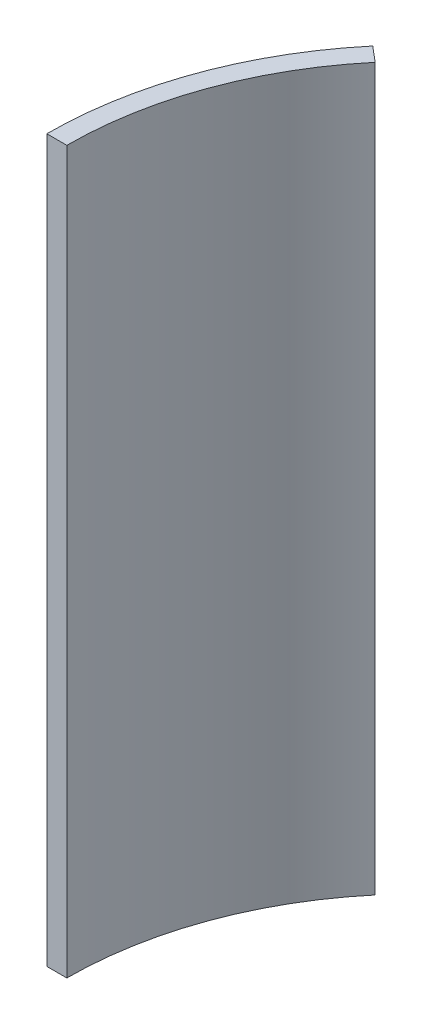
ISO-10303-21;
HEADER;
FILE_DESCRIPTION(('STEP AP214'),'2;1');
FILE_NAME('part.step','',(''),(''),'','','');
FILE_SCHEMA(('AUTOMOTIVE_DESIGN { 1 0 10303 214 1 1 1 1 }'));
ENDSEC;
DATA;
#1=APPLICATION_CONTEXT('core data for automotive mechanical design processes');
#2=APPLICATION_PROTOCOL_DEFINITION('international standard','automotive_design',2000,#1);
#3=PRODUCT_CONTEXT('',#1,'mechanical');
#4=PRODUCT('Part','Part','',(#3));
#5=PRODUCT_RELATED_PRODUCT_CATEGORY('part','',(#4));
#6=PRODUCT_DEFINITION_FORMATION('','',#4);
#7=PRODUCT_DEFINITION_CONTEXT('part definition',#1,'design');
#8=PRODUCT_DEFINITION('design','',#6,#7);
#9=PRODUCT_DEFINITION_SHAPE('','',#8);
#10=(LENGTH_UNIT() NAMED_UNIT(*) SI_UNIT(.MILLI.,.METRE.));
#11=(NAMED_UNIT(*) PLANE_ANGLE_UNIT() SI_UNIT($,.RADIAN.));
#12=(NAMED_UNIT(*) SI_UNIT($,.STERADIAN.) SOLID_ANGLE_UNIT());
#13=UNCERTAINTY_MEASURE_WITH_UNIT(LENGTH_MEASURE(1.E-05),#10,'distance_accuracy_value','');
#14=(GEOMETRIC_REPRESENTATION_CONTEXT(3) GLOBAL_UNCERTAINTY_ASSIGNED_CONTEXT((#13)) GLOBAL_UNIT_ASSIGNED_CONTEXT((#10,
#11,#12)) REPRESENTATION_CONTEXT('',''));
#15=CARTESIAN_POINT('',(0.,0.,0.));
#16=DIRECTION('',(0.,0.,1.));
#17=DIRECTION('',(1.,0.,0.));
#18=AXIS2_PLACEMENT_3D('',#15,#16,#17);
#19=CARTESIAN_POINT('',(77.7861913430201,200.,0.));
#20=DIRECTION('',(0.,-1.,0.));
#21=DIRECTION('',(0.,0.,-1.));
#22=AXIS2_PLACEMENT_3D('',#19,#20,#21);
#23=CYLINDRICAL_SURFACE('',#22,87.7861913430201);
#24=CARTESIAN_POINT('',(77.7861913430201,20.,0.));
#25=DIRECTION('',(0.,-1.,0.));
#26=DIRECTION('',(0.,0.,1.));
#27=AXIS2_PLACEMENT_3D('',#24,#25,#26);
#28=CIRCLE('',#27,87.7861913430201);
#29=CARTESIAN_POINT('',(-9.99999999999999,20.,0.));
#30=VERTEX_POINT('',#29);
#31=CARTESIAN_POINT('',(10.5380672821205,20.,-56.4278760968654));
#32=VERTEX_POINT('',#31);
#33=EDGE_CURVE('E96',#30,#32,#28,.T.);
#34=ORIENTED_EDGE('',*,*,#33,.T.);
#35=DIRECTION('',(0.,-1.,0.));
#36=VECTOR('',#35,1.);
#37=CARTESIAN_POINT('',(10.5380672821205,200.,-56.4278760968654));
#38=LINE('',#37,#36);
#39=CARTESIAN_POINT('',(10.5380672821205,200.,-56.4278760968654));
#40=VERTEX_POINT('',#39);
#41=EDGE_CURVE('E11',#40,#32,#38,.T.);
#42=ORIENTED_EDGE('',*,*,#41,.F.);
#43=CARTESIAN_POINT('',(77.7861913430201,200.,0.));
#44=DIRECTION('',(0.,-1.,0.));
#45=DIRECTION('',(0.,0.,1.));
#46=AXIS2_PLACEMENT_3D('',#43,#44,#45);
#47=CIRCLE('',#46,87.7861913430201);
#48=CARTESIAN_POINT('',(-9.99999999999999,200.,0.));
#49=VERTEX_POINT('',#48);
#50=EDGE_CURVE('E84',#49,#40,#47,.T.);
#51=ORIENTED_EDGE('',*,*,#50,.F.);
#52=DIRECTION('',(0.,-1.,0.));
#53=VECTOR('',#52,1.);
#54=CARTESIAN_POINT('',(-9.99999999999999,200.,0.));
#55=LINE('',#54,#53);
#56=EDGE_CURVE('E92',#49,#30,#55,.T.);
#57=ORIENTED_EDGE('',*,*,#56,.T.);
#58=EDGE_LOOP('',(#34,#42,#51,#57));
#59=FACE_BOUND('',#58,.T.);
#60=ADVANCED_FACE('F33',(#59),#23,.F.);
#61=CARTESIAN_POINT('',(6.70784506652562,200.,-59.6418141452981));
#62=DIRECTION('',(-0.64278760968654,0.,0.766044443118977));
#63=DIRECTION('',(0.766044443118978,0.,0.64278760968654));
#64=AXIS2_PLACEMENT_3D('',#61,#62,#63);
#65=PLANE('',#64);
#66=DIRECTION('',(-0.766044443118977,0.,-0.64278760968654));
#67=VECTOR('',#66,1.);
#68=CARTESIAN_POINT('',(6.70784506652562,20.,-59.6418141452981));
#69=LINE('',#68,#67);
#70=CARTESIAN_POINT('',(6.70784506652562,20.,-59.6418141452981));
#71=VERTEX_POINT('',#70);
#72=EDGE_CURVE('E88',#32,#71,#69,.T.);
#73=ORIENTED_EDGE('',*,*,#72,.T.);
#74=DIRECTION('',(0.,-1.,0.));
#75=VECTOR('',#74,1.);
#76=CARTESIAN_POINT('',(6.70784506652562,200.,-59.6418141452981));
#77=LINE('',#76,#75);
#78=CARTESIAN_POINT('',(6.70784506652562,200.,-59.6418141452981));
#79=VERTEX_POINT('',#78);
#80=EDGE_CURVE('E41',#79,#71,#77,.T.);
#81=ORIENTED_EDGE('',*,*,#80,.F.);
#82=DIRECTION('',(-0.766044443118977,0.,-0.64278760968654));
#83=VECTOR('',#82,1.);
#84=CARTESIAN_POINT('',(6.70784506652562,200.,-59.6418141452981));
#85=LINE('',#84,#83);
#86=EDGE_CURVE('E79',#40,#79,#85,.T.);
#87=ORIENTED_EDGE('',*,*,#86,.F.);
#88=ORIENTED_EDGE('',*,*,#41,.T.);
#89=EDGE_LOOP('',(#73,#81,#87,#88));
#90=FACE_BOUND('',#89,.T.);
#91=ADVANCED_FACE('F87',(#90),#65,.F.);
#92=CARTESIAN_POINT('',(77.7861913430201,200.,0.));
#93=DIRECTION('',(0.,-1.,0.));
#94=DIRECTION('',(0.,0.,-1.));
#95=AXIS2_PLACEMENT_3D('',#92,#93,#94);
#96=CYLINDRICAL_SURFACE('',#95,92.7861913430201);
#97=CARTESIAN_POINT('',(77.7861913430201,20.,0.));
#98=DIRECTION('',(0.,1.,0.));
#99=DIRECTION('',(0.,0.,1.));
#100=AXIS2_PLACEMENT_3D('',#97,#98,#99);
#101=CIRCLE('',#100,92.7861913430201);
#102=CARTESIAN_POINT('',(-15.,20.,0.));
#103=VERTEX_POINT('',#102);
#104=EDGE_CURVE('E66',#71,#103,#101,.T.);
#105=ORIENTED_EDGE('',*,*,#104,.T.);
#106=DIRECTION('',(0.,-1.,0.));
#107=VECTOR('',#106,1.);
#108=CARTESIAN_POINT('',(-15.,200.,0.));
#109=LINE('',#108,#107);
#110=CARTESIAN_POINT('',(-15.,200.,0.));
#111=VERTEX_POINT('',#110);
#112=EDGE_CURVE('E89',#111,#103,#109,.T.);
#113=ORIENTED_EDGE('',*,*,#112,.F.);
#114=CARTESIAN_POINT('',(77.7861913430201,200.,0.));
#115=DIRECTION('',(0.,1.,0.));
#116=DIRECTION('',(0.,0.,1.));
#117=AXIS2_PLACEMENT_3D('',#114,#115,#116);
#118=CIRCLE('',#117,92.7861913430201);
#119=EDGE_CURVE('E82',#79,#111,#118,.T.);
#120=ORIENTED_EDGE('',*,*,#119,.F.);
#121=ORIENTED_EDGE('',*,*,#80,.T.);
#122=EDGE_LOOP('',(#105,#113,#120,#121));
#123=FACE_BOUND('',#122,.T.);
#124=ADVANCED_FACE('F90',(#123),#96,.T.);
#125=CARTESIAN_POINT('',(-15.,200.,0.));
#126=DIRECTION('',(0.,0.,-1.));
#127=DIRECTION('',(-1.,0.,0.));
#128=AXIS2_PLACEMENT_3D('',#125,#126,#127);
#129=PLANE('',#128);
#130=DIRECTION('',(1.,0.,0.));
#131=VECTOR('',#130,1.);
#132=CARTESIAN_POINT('',(-15.,20.,0.));
#133=LINE('',#132,#131);
#134=EDGE_CURVE('E72',#103,#30,#133,.T.);
#135=ORIENTED_EDGE('',*,*,#134,.T.);
#136=ORIENTED_EDGE('',*,*,#56,.F.);
#137=DIRECTION('',(1.,0.,0.));
#138=VECTOR('',#137,1.);
#139=CARTESIAN_POINT('',(-15.,200.,0.));
#140=LINE('',#139,#138);
#141=EDGE_CURVE('E49',#111,#49,#140,.T.);
#142=ORIENTED_EDGE('',*,*,#141,.F.);
#143=ORIENTED_EDGE('',*,*,#112,.T.);
#144=EDGE_LOOP('',(#135,#136,#142,#143));
#145=FACE_BOUND('',#144,.T.);
#146=ADVANCED_FACE('F103',(#145),#129,.F.);
#147=CARTESIAN_POINT('',(77.7861913430201,200.,0.));
#148=DIRECTION('',(0.,1.,0.));
#149=DIRECTION('',(0.,0.,1.));
#150=AXIS2_PLACEMENT_3D('',#147,#148,#149);
#151=PLANE('',#150);
#152=ORIENTED_EDGE('',*,*,#50,.T.);
#153=ORIENTED_EDGE('',*,*,#86,.T.);
#154=ORIENTED_EDGE('',*,*,#119,.T.);
#155=ORIENTED_EDGE('',*,*,#141,.T.);
#156=EDGE_LOOP('',(#152,#153,#154,#155));
#157=FACE_BOUND('',#156,.T.);
#158=ADVANCED_FACE('F80',(#157),#151,.T.);
#159=CARTESIAN_POINT('',(77.7861913430201,20.,0.));
#160=DIRECTION('',(0.,1.,0.));
#161=DIRECTION('',(0.,0.,1.));
#162=AXIS2_PLACEMENT_3D('',#159,#160,#161);
#163=PLANE('',#162);
#164=ORIENTED_EDGE('',*,*,#33,.F.);
#165=ORIENTED_EDGE('',*,*,#134,.F.);
#166=ORIENTED_EDGE('',*,*,#104,.F.);
#167=ORIENTED_EDGE('',*,*,#72,.F.);
#168=EDGE_LOOP('',(#164,#165,#166,#167));
#169=FACE_BOUND('',#168,.T.);
#170=ADVANCED_FACE('F106',(#169),#163,.F.);
#171=CLOSED_SHELL('',(#60,#91,#124,#146,#158,#170));
#172=MANIFOLD_SOLID_BREP('B2',#171);
#173=ADVANCED_BREP_SHAPE_REPRESENTATION('',(#18,#172),#14);
#174=SHAPE_DEFINITION_REPRESENTATION(#9,#173);
ENDSEC;
END-ISO-10303-21;
